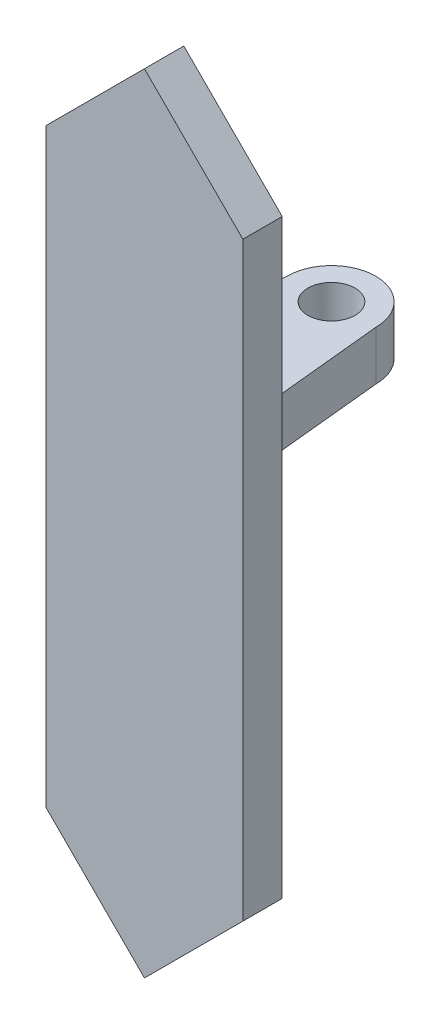
ISO-10303-21;
HEADER;
FILE_DESCRIPTION(('STEP AP214'),'2;1');
FILE_NAME('part.step','',(''),(''),'','','');
FILE_SCHEMA(('AUTOMOTIVE_DESIGN { 1 0 10303 214 1 1 1 1 }'));
ENDSEC;
DATA;
#1=APPLICATION_CONTEXT('core data for automotive mechanical design processes');
#2=APPLICATION_PROTOCOL_DEFINITION('international standard','automotive_design',2000,#1);
#3=PRODUCT_CONTEXT('',#1,'mechanical');
#4=PRODUCT('Part','Part','',(#3));
#5=PRODUCT_RELATED_PRODUCT_CATEGORY('part','',(#4));
#6=PRODUCT_DEFINITION_FORMATION('','',#4);
#7=PRODUCT_DEFINITION_CONTEXT('part definition',#1,'design');
#8=PRODUCT_DEFINITION('design','',#6,#7);
#9=PRODUCT_DEFINITION_SHAPE('','',#8);
#10=(LENGTH_UNIT() NAMED_UNIT(*) SI_UNIT(.MILLI.,.METRE.));
#11=(NAMED_UNIT(*) PLANE_ANGLE_UNIT() SI_UNIT($,.RADIAN.));
#12=(NAMED_UNIT(*) SI_UNIT($,.STERADIAN.) SOLID_ANGLE_UNIT());
#13=UNCERTAINTY_MEASURE_WITH_UNIT(LENGTH_MEASURE(1.E-05),#10,'distance_accuracy_value','');
#14=(GEOMETRIC_REPRESENTATION_CONTEXT(3) GLOBAL_UNCERTAINTY_ASSIGNED_CONTEXT((#13)) GLOBAL_UNIT_ASSIGNED_CONTEXT((#10,
#11,#12)) REPRESENTATION_CONTEXT('',''));
#15=CARTESIAN_POINT('',(0.,0.,0.));
#16=DIRECTION('',(0.,0.,1.));
#17=DIRECTION('',(1.,0.,0.));
#18=AXIS2_PLACEMENT_3D('',#15,#16,#17);
#19=CARTESIAN_POINT('',(0.,50.,-20.));
#20=DIRECTION('',(0.,1.,0.));
#21=DIRECTION('',(0.,0.,1.));
#22=AXIS2_PLACEMENT_3D('',#19,#20,#21);
#23=PLANE('',#22);
#24=CARTESIAN_POINT('',(10.1472812853162,50.,-15.));
#25=DIRECTION('',(0.,1.,0.));
#26=DIRECTION('',(0.,0.,1.));
#27=AXIS2_PLACEMENT_3D('',#24,#25,#26);
#28=CIRCLE('',#27,2.4);
#29=CARTESIAN_POINT('',(10.1472812853162,50.,-12.6));
#30=VERTEX_POINT('',#29);
#31=EDGE_CURVE('E268',#30,#30,#28,.T.);
#32=ORIENTED_EDGE('',*,*,#31,.F.);
#33=EDGE_LOOP('',(#32));
#34=FACE_BOUND('',#33,.T.);
#35=DIRECTION('',(-1.,0.,0.));
#36=VECTOR('',#35,1.);
#37=CARTESIAN_POINT('',(0.,50.,0.));
#38=LINE('',#37,#36);
#39=CARTESIAN_POINT('',(16.1472812853161,50.,0.));
#40=VERTEX_POINT('',#39);
#41=CARTESIAN_POINT('',(4.14728128531616,50.,0.));
#42=VERTEX_POINT('',#41);
#43=EDGE_CURVE('E248',#40,#42,#38,.T.);
#44=ORIENTED_EDGE('',*,*,#43,.F.);
#45=DIRECTION('',(-0.0995037190209997,0.,-0.995037190209989));
#46=VECTOR('',#45,1.);
#47=CARTESIAN_POINT('',(14.0072091933823,50.,-21.4007209193382));
#48=LINE('',#47,#46);
#49=CARTESIAN_POINT('',(14.6472812853162,50.,-15.));
#50=VERTEX_POINT('',#49);
#51=EDGE_CURVE('E260',#40,#50,#48,.T.);
#52=ORIENTED_EDGE('',*,*,#51,.T.);
#53=CARTESIAN_POINT('',(10.1472812853162,50.,-15.));
#54=DIRECTION('',(0.,1.,0.));
#55=DIRECTION('',(0.,0.,1.));
#56=AXIS2_PLACEMENT_3D('',#53,#54,#55);
#57=CIRCLE('',#56,4.5);
#58=CARTESIAN_POINT('',(5.64728128531617,50.,-15.));
#59=VERTEX_POINT('',#58);
#60=EDGE_CURVE('E256',#50,#59,#57,.T.);
#61=ORIENTED_EDGE('',*,*,#60,.T.);
#62=DIRECTION('',(0.0995037190209997,0.,-0.995037190209989));
#63=VECTOR('',#62,1.);
#64=CARTESIAN_POINT('',(6.08641711417443,50.,-19.3913582885826));
#65=LINE('',#64,#63);
#66=EDGE_CURVE('E264',#42,#59,#65,.T.);
#67=ORIENTED_EDGE('',*,*,#66,.F.);
#68=EDGE_LOOP('',(#44,#52,#61,#67));
#69=FACE_BOUND('',#68,.T.);
#70=ADVANCED_FACE('F98',(#34,#69),#23,.T.);
#71=CARTESIAN_POINT('',(0.,45.,-20.));
#72=DIRECTION('',(0.,1.,0.));
#73=DIRECTION('',(0.,0.,1.));
#74=AXIS2_PLACEMENT_3D('',#71,#72,#73);
#75=PLANE('',#74);
#76=CARTESIAN_POINT('',(10.1472812853162,45.,-15.));
#77=DIRECTION('',(0.,-1.,0.));
#78=DIRECTION('',(0.,0.,-1.));
#79=AXIS2_PLACEMENT_3D('',#76,#77,#78);
#80=CIRCLE('',#79,2.4);
#81=CARTESIAN_POINT('',(10.1472812853162,45.,-17.4));
#82=VERTEX_POINT('',#81);
#83=EDGE_CURVE('E272',#82,#82,#80,.T.);
#84=ORIENTED_EDGE('',*,*,#83,.F.);
#85=EDGE_LOOP('',(#84));
#86=FACE_BOUND('',#85,.T.);
#87=DIRECTION('',(0.0995037190209997,0.,0.995037190209989));
#88=VECTOR('',#87,1.);
#89=CARTESIAN_POINT('',(15.9874072131843,45.,-1.59874072131845));
#90=LINE('',#89,#88);
#91=CARTESIAN_POINT('',(14.6472812853162,45.,-15.));
#92=VERTEX_POINT('',#91);
#93=CARTESIAN_POINT('',(16.1472812853161,45.,0.));
#94=VERTEX_POINT('',#93);
#95=EDGE_CURVE('E280',#92,#94,#90,.T.);
#96=ORIENTED_EDGE('',*,*,#95,.T.);
#97=DIRECTION('',(-1.,0.,0.));
#98=VECTOR('',#97,1.);
#99=CARTESIAN_POINT('',(0.,45.,0.));
#100=LINE('',#99,#98);
#101=CARTESIAN_POINT('',(4.14728128531616,45.,0.));
#102=VERTEX_POINT('',#101);
#103=EDGE_CURVE('E202',#94,#102,#100,.T.);
#104=ORIENTED_EDGE('',*,*,#103,.T.);
#105=DIRECTION('',(-0.0995037190209997,0.,0.995037190209989));
#106=VECTOR('',#105,1.);
#107=CARTESIAN_POINT('',(4.10621909437243,45.,0.410621909437246));
#108=LINE('',#107,#106);
#109=CARTESIAN_POINT('',(5.64728128531617,45.,-15.));
#110=VERTEX_POINT('',#109);
#111=EDGE_CURVE('E286',#110,#102,#108,.T.);
#112=ORIENTED_EDGE('',*,*,#111,.F.);
#113=CARTESIAN_POINT('',(10.1472812853162,45.,-15.));
#114=DIRECTION('',(0.,-1.,0.));
#115=DIRECTION('',(0.,0.,-1.));
#116=AXIS2_PLACEMENT_3D('',#113,#114,#115);
#117=CIRCLE('',#116,4.5);
#118=EDGE_CURVE('E114',#110,#92,#117,.T.);
#119=ORIENTED_EDGE('',*,*,#118,.T.);
#120=EDGE_LOOP('',(#96,#104,#112,#119));
#121=FACE_BOUND('',#120,.T.);
#122=ADVANCED_FACE('F294',(#86,#121),#75,.F.);
#123=CARTESIAN_POINT('',(45.0736406426581,45.0736406426581,4.));
#124=DIRECTION('',(0.707106781186548,0.707106781186547,0.));
#125=DIRECTION('',(-0.707106781186547,0.707106781186548,0.));
#126=AXIS2_PLACEMENT_3D('',#123,#124,#125);
#127=PLANE('',#126);
#128=DIRECTION('',(0.707106781186547,-0.707106781186548,0.));
#129=VECTOR('',#128,1.);
#130=CARTESIAN_POINT('',(45.0736406426581,45.0736406426581,0.));
#131=LINE('',#130,#129);
#132=CARTESIAN_POINT('',(10.1472812853162,80.,0.));
#133=VERTEX_POINT('',#132);
#134=CARTESIAN_POINT('',(20.1472812853162,70.,0.));
#135=VERTEX_POINT('',#134);
#136=EDGE_CURVE('E210',#133,#135,#131,.T.);
#137=ORIENTED_EDGE('',*,*,#136,.F.);
#138=DIRECTION('',(0.,0.,-1.));
#139=VECTOR('',#138,1.);
#140=CARTESIAN_POINT('',(10.1472812853162,80.,4.));
#141=LINE('',#140,#139);
#142=CARTESIAN_POINT('',(10.1472812853162,80.,4.));
#143=VERTEX_POINT('',#142);
#144=EDGE_CURVE('E188',#143,#133,#141,.T.);
#145=ORIENTED_EDGE('',*,*,#144,.F.);
#146=DIRECTION('',(0.707106781186547,-0.707106781186548,0.));
#147=VECTOR('',#146,1.);
#148=CARTESIAN_POINT('',(45.0736406426581,45.0736406426581,4.));
#149=LINE('',#148,#147);
#150=CARTESIAN_POINT('',(20.1472812853162,70.,4.));
#151=VERTEX_POINT('',#150);
#152=EDGE_CURVE('E170',#143,#151,#149,.T.);
#153=ORIENTED_EDGE('',*,*,#152,.T.);
#154=DIRECTION('',(0.,0.,-1.));
#155=VECTOR('',#154,1.);
#156=CARTESIAN_POINT('',(20.1472812853162,70.,4.));
#157=LINE('',#156,#155);
#158=EDGE_CURVE('E179',#151,#135,#157,.T.);
#159=ORIENTED_EDGE('',*,*,#158,.T.);
#160=EDGE_LOOP('',(#137,#145,#153,#159));
#161=FACE_BOUND('',#160,.T.);
#162=ADVANCED_FACE('F190',(#161),#127,.T.);
#163=CARTESIAN_POINT('',(0.,0.,0.));
#164=DIRECTION('',(0.,0.,1.));
#165=DIRECTION('',(1.,0.,0.));
#166=AXIS2_PLACEMENT_3D('',#163,#164,#165);
#167=PLANE('',#166);
#168=ORIENTED_EDGE('',*,*,#43,.T.);
#169=DIRECTION('',(0.,-1.,0.));
#170=VECTOR('',#169,1.);
#171=CARTESIAN_POINT('',(4.14728128531616,0.,0.));
#172=LINE('',#171,#170);
#173=EDGE_CURVE('E252',#42,#102,#172,.T.);
#174=ORIENTED_EDGE('',*,*,#173,.T.);
#175=ORIENTED_EDGE('',*,*,#103,.F.);
#176=DIRECTION('',(0.,-1.,0.));
#177=VECTOR('',#176,1.);
#178=CARTESIAN_POINT('',(16.1472812853161,0.,0.));
#179=LINE('',#178,#177);
#180=EDGE_CURVE('E244',#40,#94,#179,.T.);
#181=ORIENTED_EDGE('',*,*,#180,.F.);
#182=EDGE_LOOP('',(#168,#174,#175,#181));
#183=FACE_BOUND('',#182,.T.);
#184=DIRECTION('',(0.,1.,0.));
#185=VECTOR('',#184,1.);
#186=CARTESIAN_POINT('',(0.147281285316174,0.,0.));
#187=LINE('',#186,#185);
#188=CARTESIAN_POINT('',(0.147281285316174,9.99999999999999,0.));
#189=VERTEX_POINT('',#188);
#190=CARTESIAN_POINT('',(0.147281285316174,70.,0.));
#191=VERTEX_POINT('',#190);
#192=EDGE_CURVE('E198',#189,#191,#187,.T.);
#193=ORIENTED_EDGE('',*,*,#192,.T.);
#194=DIRECTION('',(0.707106781186548,0.707106781186548,0.));
#195=VECTOR('',#194,1.);
#196=CARTESIAN_POINT('',(-34.9263593573419,34.9263593573419,0.));
#197=LINE('',#196,#195);
#198=EDGE_CURVE('E213',#191,#133,#197,.T.);
#199=ORIENTED_EDGE('',*,*,#198,.T.);
#200=ORIENTED_EDGE('',*,*,#136,.T.);
#201=DIRECTION('',(0.,1.,0.));
#202=VECTOR('',#201,1.);
#203=CARTESIAN_POINT('',(20.1472812853162,0.,0.));
#204=LINE('',#203,#202);
#205=CARTESIAN_POINT('',(20.1472812853162,10.,0.));
#206=VERTEX_POINT('',#205);
#207=EDGE_CURVE('E182',#206,#135,#204,.T.);
#208=ORIENTED_EDGE('',*,*,#207,.F.);
#209=DIRECTION('',(0.707106781186548,0.707106781186548,0.));
#210=VECTOR('',#209,1.);
#211=CARTESIAN_POINT('',(5.07364064265808,-5.07364064265808,0.));
#212=LINE('',#211,#210);
#213=CARTESIAN_POINT('',(10.1472812853162,0.,0.));
#214=VERTEX_POINT('',#213);
#215=EDGE_CURVE('E205',#214,#206,#212,.T.);
#216=ORIENTED_EDGE('',*,*,#215,.F.);
#217=DIRECTION('',(0.707106781186548,-0.707106781186548,0.));
#218=VECTOR('',#217,1.);
#219=CARTESIAN_POINT('',(5.07364064265808,5.07364064265808,0.));
#220=LINE('',#219,#218);
#221=EDGE_CURVE('E201',#189,#214,#220,.T.);
#222=ORIENTED_EDGE('',*,*,#221,.F.);
#223=EDGE_LOOP('',(#193,#199,#200,#208,#216,#222));
#224=FACE_BOUND('',#223,.T.);
#225=ADVANCED_FACE('F232',(#183,#224),#167,.F.);
#226=CARTESIAN_POINT('',(20.1472812853162,0.,4.));
#227=DIRECTION('',(-1.,0.,0.));
#228=DIRECTION('',(0.,0.,1.));
#229=AXIS2_PLACEMENT_3D('',#226,#227,#228);
#230=PLANE('',#229);
#231=ORIENTED_EDGE('',*,*,#207,.T.);
#232=ORIENTED_EDGE('',*,*,#158,.F.);
#233=DIRECTION('',(0.,1.,0.));
#234=VECTOR('',#233,1.);
#235=CARTESIAN_POINT('',(20.1472812853162,0.,4.));
#236=LINE('',#235,#234);
#237=CARTESIAN_POINT('',(20.1472812853162,10.,4.));
#238=VERTEX_POINT('',#237);
#239=EDGE_CURVE('E164',#238,#151,#236,.T.);
#240=ORIENTED_EDGE('',*,*,#239,.F.);
#241=DIRECTION('',(0.,0.,-1.));
#242=VECTOR('',#241,1.);
#243=CARTESIAN_POINT('',(20.1472812853162,10.,4.));
#244=LINE('',#243,#242);
#245=EDGE_CURVE('E187',#238,#206,#244,.T.);
#246=ORIENTED_EDGE('',*,*,#245,.T.);
#247=EDGE_LOOP('',(#231,#232,#240,#246));
#248=FACE_BOUND('',#247,.T.);
#249=ADVANCED_FACE('F180',(#248),#230,.F.);
#250=CARTESIAN_POINT('',(5.07364064265808,-5.07364064265808,4.));
#251=DIRECTION('',(-0.707106781186547,0.707106781186547,0.));
#252=DIRECTION('',(-0.707106781186548,-0.707106781186548,0.));
#253=AXIS2_PLACEMENT_3D('',#250,#251,#252);
#254=PLANE('',#253);
#255=ORIENTED_EDGE('',*,*,#215,.T.);
#256=ORIENTED_EDGE('',*,*,#245,.F.);
#257=DIRECTION('',(0.707106781186548,0.707106781186548,0.));
#258=VECTOR('',#257,1.);
#259=CARTESIAN_POINT('',(5.07364064265808,-5.07364064265808,4.));
#260=LINE('',#259,#258);
#261=CARTESIAN_POINT('',(10.1472812853162,0.,4.));
#262=VERTEX_POINT('',#261);
#263=EDGE_CURVE('E172',#262,#238,#260,.T.);
#264=ORIENTED_EDGE('',*,*,#263,.F.);
#265=DIRECTION('',(0.,0.,-1.));
#266=VECTOR('',#265,1.);
#267=CARTESIAN_POINT('',(10.1472812853162,0.,4.));
#268=LINE('',#267,#266);
#269=EDGE_CURVE('E107',#262,#214,#268,.T.);
#270=ORIENTED_EDGE('',*,*,#269,.T.);
#271=EDGE_LOOP('',(#255,#256,#264,#270));
#272=FACE_BOUND('',#271,.T.);
#273=ADVANCED_FACE('F228',(#272),#254,.F.);
#274=CARTESIAN_POINT('',(5.07364064265808,5.07364064265808,4.));
#275=DIRECTION('',(0.707106781186547,0.707106781186547,0.));
#276=DIRECTION('',(-0.707106781186548,0.707106781186548,0.));
#277=AXIS2_PLACEMENT_3D('',#274,#275,#276);
#278=PLANE('',#277);
#279=ORIENTED_EDGE('',*,*,#221,.T.);
#280=ORIENTED_EDGE('',*,*,#269,.F.);
#281=DIRECTION('',(0.707106781186548,-0.707106781186548,0.));
#282=VECTOR('',#281,1.);
#283=CARTESIAN_POINT('',(5.07364064265808,5.07364064265808,4.));
#284=LINE('',#283,#282);
#285=CARTESIAN_POINT('',(0.147281285316174,9.99999999999999,4.));
#286=VERTEX_POINT('',#285);
#287=EDGE_CURVE('E234',#286,#262,#284,.T.);
#288=ORIENTED_EDGE('',*,*,#287,.F.);
#289=DIRECTION('',(0.,0.,-1.));
#290=VECTOR('',#289,1.);
#291=CARTESIAN_POINT('',(0.147281285316174,9.99999999999999,4.));
#292=LINE('',#291,#290);
#293=EDGE_CURVE('E12',#286,#189,#292,.T.);
#294=ORIENTED_EDGE('',*,*,#293,.T.);
#295=EDGE_LOOP('',(#279,#280,#288,#294));
#296=FACE_BOUND('',#295,.T.);
#297=ADVANCED_FACE('F351',(#296),#278,.F.);
#298=CARTESIAN_POINT('',(0.147281285316174,0.,4.));
#299=DIRECTION('',(-1.,0.,0.));
#300=DIRECTION('',(0.,0.,1.));
#301=AXIS2_PLACEMENT_3D('',#298,#299,#300);
#302=PLANE('',#301);
#303=ORIENTED_EDGE('',*,*,#192,.F.);
#304=ORIENTED_EDGE('',*,*,#293,.F.);
#305=DIRECTION('',(0.,1.,0.));
#306=VECTOR('',#305,1.);
#307=CARTESIAN_POINT('',(0.147281285316174,0.,4.));
#308=LINE('',#307,#306);
#309=CARTESIAN_POINT('',(0.147281285316174,70.,4.));
#310=VERTEX_POINT('',#309);
#311=EDGE_CURVE('E217',#286,#310,#308,.T.);
#312=ORIENTED_EDGE('',*,*,#311,.T.);
#313=DIRECTION('',(0.,0.,-1.));
#314=VECTOR('',#313,1.);
#315=CARTESIAN_POINT('',(0.147281285316174,70.,4.));
#316=LINE('',#315,#314);
#317=EDGE_CURVE('E123',#310,#191,#316,.T.);
#318=ORIENTED_EDGE('',*,*,#317,.T.);
#319=EDGE_LOOP('',(#303,#304,#312,#318));
#320=FACE_BOUND('',#319,.T.);
#321=ADVANCED_FACE('F100',(#320),#302,.T.);
#322=CARTESIAN_POINT('',(-34.9263593573419,34.9263593573419,4.));
#323=DIRECTION('',(-0.707106781186547,0.707106781186547,0.));
#324=DIRECTION('',(-0.707106781186548,-0.707106781186548,0.));
#325=AXIS2_PLACEMENT_3D('',#322,#323,#324);
#326=PLANE('',#325);
#327=ORIENTED_EDGE('',*,*,#198,.F.);
#328=ORIENTED_EDGE('',*,*,#317,.F.);
#329=DIRECTION('',(0.707106781186548,0.707106781186548,0.));
#330=VECTOR('',#329,1.);
#331=CARTESIAN_POINT('',(-34.9263593573419,34.9263593573419,4.));
#332=LINE('',#331,#330);
#333=EDGE_CURVE('E192',#310,#143,#332,.T.);
#334=ORIENTED_EDGE('',*,*,#333,.T.);
#335=ORIENTED_EDGE('',*,*,#144,.T.);
#336=EDGE_LOOP('',(#327,#328,#334,#335));
#337=FACE_BOUND('',#336,.T.);
#338=ADVANCED_FACE('F233',(#337),#326,.T.);
#339=CARTESIAN_POINT('',(0.,0.,4.));
#340=DIRECTION('',(0.,0.,1.));
#341=DIRECTION('',(1.,0.,0.));
#342=AXIS2_PLACEMENT_3D('',#339,#340,#341);
#343=PLANE('',#342);
#344=ORIENTED_EDGE('',*,*,#311,.F.);
#345=ORIENTED_EDGE('',*,*,#287,.T.);
#346=ORIENTED_EDGE('',*,*,#263,.T.);
#347=ORIENTED_EDGE('',*,*,#239,.T.);
#348=ORIENTED_EDGE('',*,*,#152,.F.);
#349=ORIENTED_EDGE('',*,*,#333,.F.);
#350=EDGE_LOOP('',(#344,#345,#346,#347,#348,#349));
#351=FACE_BOUND('',#350,.T.);
#352=ADVANCED_FACE('F167',(#351),#343,.T.);
#353=CARTESIAN_POINT('',(10.1472812853162,66.,-15.));
#354=DIRECTION('',(0.,-1.,0.));
#355=DIRECTION('',(0.,0.,-1.));
#356=AXIS2_PLACEMENT_3D('',#353,#354,#355);
#357=CYLINDRICAL_SURFACE('',#356,2.4);
#358=ORIENTED_EDGE('',*,*,#31,.T.);
#359=EDGE_LOOP('',(#358));
#360=FACE_BOUND('',#359,.T.);
#361=ORIENTED_EDGE('',*,*,#83,.T.);
#362=EDGE_LOOP('',(#361));
#363=FACE_BOUND('',#362,.T.);
#364=ADVANCED_FACE('F341',(#360,#363),#357,.F.);
#365=CARTESIAN_POINT('',(10.1472812853162,66.,-15.));
#366=DIRECTION('',(0.,-1.,0.));
#367=DIRECTION('',(0.,0.,-1.));
#368=AXIS2_PLACEMENT_3D('',#365,#366,#367);
#369=CYLINDRICAL_SURFACE('',#368,4.5);
#370=DIRECTION('',(0.,-1.,0.));
#371=VECTOR('',#370,1.);
#372=CARTESIAN_POINT('',(14.6472812853162,66.,-15.));
#373=LINE('',#372,#371);
#374=EDGE_CURVE('E276',#50,#92,#373,.T.);
#375=ORIENTED_EDGE('',*,*,#374,.T.);
#376=ORIENTED_EDGE('',*,*,#118,.F.);
#377=DIRECTION('',(0.,-1.,0.));
#378=VECTOR('',#377,1.);
#379=CARTESIAN_POINT('',(5.64728128531617,66.,-15.));
#380=LINE('',#379,#378);
#381=EDGE_CURVE('E277',#59,#110,#380,.T.);
#382=ORIENTED_EDGE('',*,*,#381,.F.);
#383=ORIENTED_EDGE('',*,*,#60,.F.);
#384=EDGE_LOOP('',(#375,#376,#382,#383));
#385=FACE_BOUND('',#384,.T.);
#386=ADVANCED_FACE('F313',(#385),#369,.T.);
#387=CARTESIAN_POINT('',(15.9874072131843,66.,-1.59874072131845));
#388=DIRECTION('',(0.995037190209989,0.,-0.0995037190209997));
#389=DIRECTION('',(-0.0995037190209997,0.,-0.995037190209989));
#390=AXIS2_PLACEMENT_3D('',#387,#388,#389);
#391=PLANE('',#390);
#392=ORIENTED_EDGE('',*,*,#180,.T.);
#393=ORIENTED_EDGE('',*,*,#95,.F.);
#394=ORIENTED_EDGE('',*,*,#374,.F.);
#395=ORIENTED_EDGE('',*,*,#51,.F.);
#396=EDGE_LOOP('',(#392,#393,#394,#395));
#397=FACE_BOUND('',#396,.T.);
#398=ADVANCED_FACE('F316',(#397),#391,.T.);
#399=CARTESIAN_POINT('',(4.10621909437243,66.,0.410621909437246));
#400=DIRECTION('',(0.995037190209989,0.,0.0995037190209996));
#401=DIRECTION('',(0.0995037190209997,0.,-0.995037190209989));
#402=AXIS2_PLACEMENT_3D('',#399,#400,#401);
#403=PLANE('',#402);
#404=ORIENTED_EDGE('',*,*,#66,.T.);
#405=ORIENTED_EDGE('',*,*,#381,.T.);
#406=ORIENTED_EDGE('',*,*,#111,.T.);
#407=ORIENTED_EDGE('',*,*,#173,.F.);
#408=EDGE_LOOP('',(#404,#405,#406,#407));
#409=FACE_BOUND('',#408,.T.);
#410=ADVANCED_FACE('F320',(#409),#403,.F.);
#411=CLOSED_SHELL('',(#70,#122,#162,#225,#249,#273,#297,#321,#338,#352,#364,#386,#398,#410));
#412=MANIFOLD_SOLID_BREP('B2',#411);
#413=ADVANCED_BREP_SHAPE_REPRESENTATION('',(#18,#412),#14);
#414=SHAPE_DEFINITION_REPRESENTATION(#9,#413);
ENDSEC;
END-ISO-10303-21;
